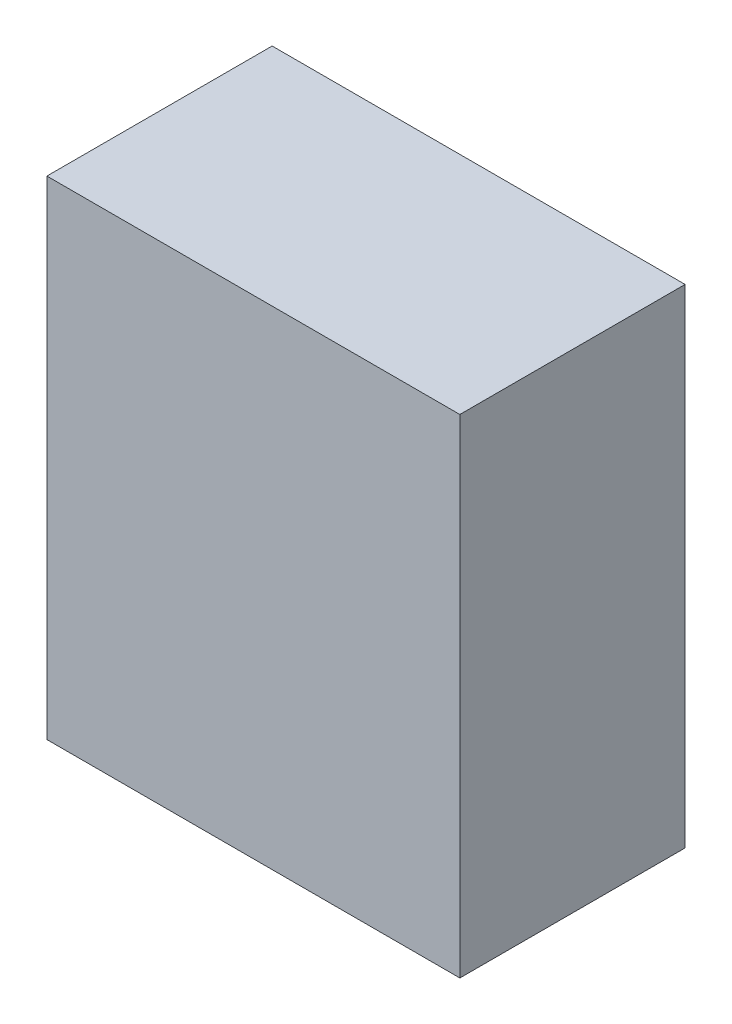
ISO-10303-21;
HEADER;
FILE_DESCRIPTION(('STEP AP214'),'2;1');
FILE_NAME('part.step','',(''),(''),'','','');
FILE_SCHEMA(('AUTOMOTIVE_DESIGN { 1 0 10303 214 1 1 1 1 }'));
ENDSEC;
DATA;
#1=APPLICATION_CONTEXT('core data for automotive mechanical design processes');
#2=APPLICATION_PROTOCOL_DEFINITION('international standard','automotive_design',2000,#1);
#3=PRODUCT_CONTEXT('',#1,'mechanical');
#4=PRODUCT('Part','Part','',(#3));
#5=PRODUCT_RELATED_PRODUCT_CATEGORY('part','',(#4));
#6=PRODUCT_DEFINITION_FORMATION('','',#4);
#7=PRODUCT_DEFINITION_CONTEXT('part definition',#1,'design');
#8=PRODUCT_DEFINITION('design','',#6,#7);
#9=PRODUCT_DEFINITION_SHAPE('','',#8);
#10=(LENGTH_UNIT() NAMED_UNIT(*) SI_UNIT(.MILLI.,.METRE.));
#11=(NAMED_UNIT(*) PLANE_ANGLE_UNIT() SI_UNIT($,.RADIAN.));
#12=(NAMED_UNIT(*) SI_UNIT($,.STERADIAN.) SOLID_ANGLE_UNIT());
#13=UNCERTAINTY_MEASURE_WITH_UNIT(LENGTH_MEASURE(1.E-05),#10,'distance_accuracy_value','');
#14=(GEOMETRIC_REPRESENTATION_CONTEXT(3) GLOBAL_UNCERTAINTY_ASSIGNED_CONTEXT((#13)) GLOBAL_UNIT_ASSIGNED_CONTEXT((#10,
#11,#12)) REPRESENTATION_CONTEXT('',''));
#15=CARTESIAN_POINT('',(0.,0.,0.));
#16=DIRECTION('',(0.,0.,1.));
#17=DIRECTION('',(1.,0.,0.));
#18=AXIS2_PLACEMENT_3D('',#15,#16,#17);
#19=CARTESIAN_POINT('',(0.,0.,38.1));
#20=DIRECTION('',(0.,1.,0.));
#21=DIRECTION('',(0.,0.,1.));
#22=AXIS2_PLACEMENT_3D('',#19,#20,#21);
#23=PLANE('',#22);
#24=DIRECTION('',(0.,0.,-1.));
#25=VECTOR('',#24,1.);
#26=CARTESIAN_POINT('',(-28.5496,0.,2.8194));
#27=LINE('',#26,#25);
#28=CARTESIAN_POINT('',(-28.5496,0.,0.));
#29=VERTEX_POINT('',#28);
#30=CARTESIAN_POINT('',(-28.5496,0.,2.8194));
#31=VERTEX_POINT('',#30);
#32=EDGE_CURVE('E100',#29,#31,#27,.F.);
#33=ORIENTED_EDGE('',*,*,#32,.F.);
#34=DIRECTION('',(1.,0.,0.));
#35=VECTOR('',#34,1.);
#36=CARTESIAN_POINT('',(0.,0.,0.));
#37=LINE('',#36,#35);
#38=CARTESIAN_POINT('',(0.,0.,0.));
#39=VERTEX_POINT('',#38);
#40=EDGE_CURVE('E107',#29,#39,#37,.T.);
#41=ORIENTED_EDGE('',*,*,#40,.T.);
#42=DIRECTION('',(0.,0.,-1.));
#43=VECTOR('',#42,1.);
#44=CARTESIAN_POINT('',(0.,0.,38.1));
#45=LINE('',#44,#43);
#46=CARTESIAN_POINT('',(0.,0.,38.1));
#47=VERTEX_POINT('',#46);
#48=EDGE_CURVE('E46',#47,#39,#45,.T.);
#49=ORIENTED_EDGE('',*,*,#48,.F.);
#50=DIRECTION('',(1.,0.,0.));
#51=VECTOR('',#50,1.);
#52=CARTESIAN_POINT('',(0.,0.,38.1));
#53=LINE('',#52,#51);
#54=CARTESIAN_POINT('',(-69.85,0.,38.1));
#55=VERTEX_POINT('',#54);
#56=EDGE_CURVE('E118',#55,#47,#53,.T.);
#57=ORIENTED_EDGE('',*,*,#56,.F.);
#58=DIRECTION('',(0.,0.,-1.));
#59=VECTOR('',#58,1.);
#60=CARTESIAN_POINT('',(-69.85,0.,38.1));
#61=LINE('',#60,#59);
#62=CARTESIAN_POINT('',(-69.85,0.,0.));
#63=VERTEX_POINT('',#62);
#64=EDGE_CURVE('E124',#55,#63,#61,.T.);
#65=ORIENTED_EDGE('',*,*,#64,.T.);
#66=CARTESIAN_POINT('',(-54.0004,0.,0.));
#67=VERTEX_POINT('',#66);
#68=EDGE_CURVE('E114',#63,#67,#37,.T.);
#69=ORIENTED_EDGE('',*,*,#68,.T.);
#70=DIRECTION('',(0.,0.,-1.));
#71=VECTOR('',#70,1.);
#72=CARTESIAN_POINT('',(-54.0004,0.,2.8194));
#73=LINE('',#72,#71);
#74=CARTESIAN_POINT('',(-54.0004,0.,2.8194));
#75=VERTEX_POINT('',#74);
#76=EDGE_CURVE('E53',#75,#67,#73,.T.);
#77=ORIENTED_EDGE('',*,*,#76,.F.);
#78=DIRECTION('',(1.,0.,0.));
#79=VECTOR('',#78,1.);
#80=CARTESIAN_POINT('',(0.,0.,2.8194));
#81=LINE('',#80,#79);
#82=EDGE_CURVE('E11',#75,#31,#81,.T.);
#83=ORIENTED_EDGE('',*,*,#82,.T.);
#84=EDGE_LOOP('',(#33,#41,#49,#57,#65,#69,#77,#83));
#85=FACE_BOUND('',#84,.T.);
#86=ADVANCED_FACE('F39',(#85),#23,.F.);
#87=CARTESIAN_POINT('',(0.,0.,38.1));
#88=DIRECTION('',(-1.,0.,0.));
#89=DIRECTION('',(0.,0.,1.));
#90=AXIS2_PLACEMENT_3D('',#87,#88,#89);
#91=PLANE('',#90);
#92=DIRECTION('',(0.,1.,0.));
#93=VECTOR('',#92,1.);
#94=CARTESIAN_POINT('',(0.,0.,0.));
#95=LINE('',#94,#93);
#96=CARTESIAN_POINT('',(0.,82.55,0.));
#97=VERTEX_POINT('',#96);
#98=EDGE_CURVE('E126',#39,#97,#95,.T.);
#99=ORIENTED_EDGE('',*,*,#98,.T.);
#100=DIRECTION('',(0.,0.,-1.));
#101=VECTOR('',#100,1.);
#102=CARTESIAN_POINT('',(0.,82.55,38.1));
#103=LINE('',#102,#101);
#104=CARTESIAN_POINT('',(0.,82.55,38.1));
#105=VERTEX_POINT('',#104);
#106=EDGE_CURVE('E134',#105,#97,#103,.T.);
#107=ORIENTED_EDGE('',*,*,#106,.F.);
#108=DIRECTION('',(0.,1.,0.));
#109=VECTOR('',#108,1.);
#110=CARTESIAN_POINT('',(0.,0.,38.1));
#111=LINE('',#110,#109);
#112=EDGE_CURVE('E91',#47,#105,#111,.T.);
#113=ORIENTED_EDGE('',*,*,#112,.F.);
#114=ORIENTED_EDGE('',*,*,#48,.T.);
#115=EDGE_LOOP('',(#99,#107,#113,#114));
#116=FACE_BOUND('',#115,.T.);
#117=ADVANCED_FACE('F137',(#116),#91,.F.);
#118=CARTESIAN_POINT('',(0.,82.55,38.1));
#119=DIRECTION('',(0.,-1.,0.));
#120=DIRECTION('',(0.,0.,-1.));
#121=AXIS2_PLACEMENT_3D('',#118,#119,#120);
#122=PLANE('',#121);
#123=DIRECTION('',(-1.,0.,0.));
#124=VECTOR('',#123,1.);
#125=CARTESIAN_POINT('',(0.,82.55,0.));
#126=LINE('',#125,#124);
#127=CARTESIAN_POINT('',(-69.85,82.55,0.));
#128=VERTEX_POINT('',#127);
#129=EDGE_CURVE('E128',#97,#128,#126,.T.);
#130=ORIENTED_EDGE('',*,*,#129,.T.);
#131=DIRECTION('',(0.,0.,-1.));
#132=VECTOR('',#131,1.);
#133=CARTESIAN_POINT('',(-69.85,82.55,38.1));
#134=LINE('',#133,#132);
#135=CARTESIAN_POINT('',(-69.85,82.55,38.1));
#136=VERTEX_POINT('',#135);
#137=EDGE_CURVE('E132',#136,#128,#134,.T.);
#138=ORIENTED_EDGE('',*,*,#137,.F.);
#139=DIRECTION('',(-1.,0.,0.));
#140=VECTOR('',#139,1.);
#141=CARTESIAN_POINT('',(0.,82.55,38.1));
#142=LINE('',#141,#140);
#143=EDGE_CURVE('E121',#105,#136,#142,.T.);
#144=ORIENTED_EDGE('',*,*,#143,.F.);
#145=ORIENTED_EDGE('',*,*,#106,.T.);
#146=EDGE_LOOP('',(#130,#138,#144,#145));
#147=FACE_BOUND('',#146,.T.);
#148=ADVANCED_FACE('F145',(#147),#122,.F.);
#149=CARTESIAN_POINT('',(-69.85,0.,38.1));
#150=DIRECTION('',(1.,0.,0.));
#151=DIRECTION('',(0.,0.,-1.));
#152=AXIS2_PLACEMENT_3D('',#149,#150,#151);
#153=PLANE('',#152);
#154=DIRECTION('',(0.,-1.,0.));
#155=VECTOR('',#154,1.);
#156=CARTESIAN_POINT('',(-69.85,0.,0.));
#157=LINE('',#156,#155);
#158=EDGE_CURVE('E83',#128,#63,#157,.T.);
#159=ORIENTED_EDGE('',*,*,#158,.T.);
#160=ORIENTED_EDGE('',*,*,#64,.F.);
#161=DIRECTION('',(0.,-1.,0.));
#162=VECTOR('',#161,1.);
#163=CARTESIAN_POINT('',(-69.85,0.,38.1));
#164=LINE('',#163,#162);
#165=EDGE_CURVE('E62',#136,#55,#164,.T.);
#166=ORIENTED_EDGE('',*,*,#165,.F.);
#167=ORIENTED_EDGE('',*,*,#137,.T.);
#168=EDGE_LOOP('',(#159,#160,#166,#167));
#169=FACE_BOUND('',#168,.T.);
#170=ADVANCED_FACE('F147',(#169),#153,.F.);
#171=CARTESIAN_POINT('',(0.,0.,38.1));
#172=DIRECTION('',(0.,0.,-1.));
#173=DIRECTION('',(-1.,0.,0.));
#174=AXIS2_PLACEMENT_3D('',#171,#172,#173);
#175=PLANE('',#174);
#176=ORIENTED_EDGE('',*,*,#56,.T.);
#177=ORIENTED_EDGE('',*,*,#112,.T.);
#178=ORIENTED_EDGE('',*,*,#143,.T.);
#179=ORIENTED_EDGE('',*,*,#165,.T.);
#180=EDGE_LOOP('',(#176,#177,#178,#179));
#181=FACE_BOUND('',#180,.T.);
#182=ADVANCED_FACE('F149',(#181),#175,.F.);
#183=CARTESIAN_POINT('',(0.,0.,0.));
#184=DIRECTION('',(0.,0.,-1.));
#185=DIRECTION('',(-1.,0.,0.));
#186=AXIS2_PLACEMENT_3D('',#183,#184,#185);
#187=PLANE('',#186);
#188=ORIENTED_EDGE('',*,*,#40,.F.);
#189=CARTESIAN_POINT('',(-41.275,0.,0.));
#190=DIRECTION('',(0.,0.,1.));
#191=DIRECTION('',(1.,0.,0.));
#192=AXIS2_PLACEMENT_3D('',#189,#190,#191);
#193=CIRCLE('',#192,12.7254);
#194=EDGE_CURVE('E104',#29,#67,#193,.T.);
#195=ORIENTED_EDGE('',*,*,#194,.T.);
#196=ORIENTED_EDGE('',*,*,#68,.F.);
#197=ORIENTED_EDGE('',*,*,#158,.F.);
#198=ORIENTED_EDGE('',*,*,#129,.F.);
#199=ORIENTED_EDGE('',*,*,#98,.F.);
#200=EDGE_LOOP('',(#188,#195,#196,#197,#198,#199));
#201=FACE_BOUND('',#200,.T.);
#202=ADVANCED_FACE('F142',(#201),#187,.T.);
#203=CARTESIAN_POINT('',(-41.275,0.,2.8194));
#204=DIRECTION('',(0.,0.,1.));
#205=DIRECTION('',(1.,0.,0.));
#206=AXIS2_PLACEMENT_3D('',#203,#204,#205);
#207=PLANE('',#206);
#208=CARTESIAN_POINT('',(-41.275,0.,2.8194));
#209=DIRECTION('',(0.,0.,1.));
#210=DIRECTION('',(1.,0.,0.));
#211=AXIS2_PLACEMENT_3D('',#208,#209,#210);
#212=CIRCLE('',#211,12.7254);
#213=EDGE_CURVE('E103',#31,#75,#212,.T.);
#214=ORIENTED_EDGE('',*,*,#213,.F.);
#215=ORIENTED_EDGE('',*,*,#82,.F.);
#216=EDGE_LOOP('',(#214,#215));
#217=FACE_BOUND('',#216,.T.);
#218=ADVANCED_FACE('F110',(#217),#207,.F.);
#219=CARTESIAN_POINT('',(-41.275,0.,2.8194));
#220=DIRECTION('',(0.,0.,-1.));
#221=DIRECTION('',(-1.,0.,0.));
#222=AXIS2_PLACEMENT_3D('',#219,#220,#221);
#223=CYLINDRICAL_SURFACE('',#222,12.7254);
#224=ORIENTED_EDGE('',*,*,#32,.T.);
#225=ORIENTED_EDGE('',*,*,#213,.T.);
#226=ORIENTED_EDGE('',*,*,#76,.T.);
#227=ORIENTED_EDGE('',*,*,#194,.F.);
#228=EDGE_LOOP('',(#224,#225,#226,#227));
#229=FACE_BOUND('',#228,.T.);
#230=ADVANCED_FACE('F102',(#229),#223,.F.);
#231=CLOSED_SHELL('',(#86,#117,#148,#170,#182,#202,#218,#230));
#232=MANIFOLD_SOLID_BREP('B2',#231);
#233=ADVANCED_BREP_SHAPE_REPRESENTATION('',(#18,#232),#14);
#234=SHAPE_DEFINITION_REPRESENTATION(#9,#233);
ENDSEC;
END-ISO-10303-21;
